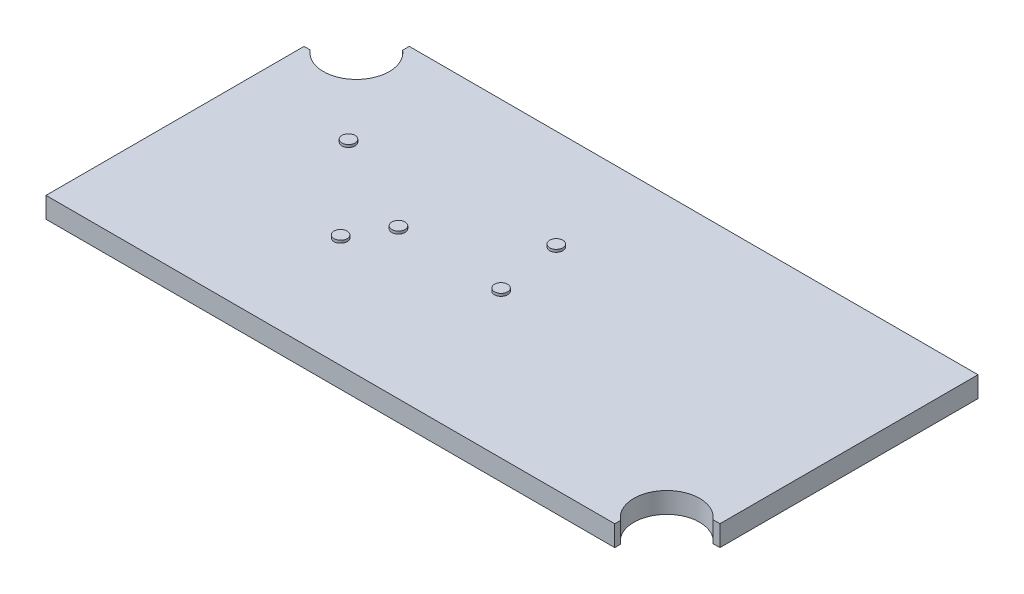
ISO-10303-21;
HEADER;
FILE_DESCRIPTION(('STEP AP214'),'2;1');
FILE_NAME('part.step','',(''),(''),'','','');
FILE_SCHEMA(('AUTOMOTIVE_DESIGN { 1 0 10303 214 1 1 1 1 }'));
ENDSEC;
DATA;
#1=APPLICATION_CONTEXT('core data for automotive mechanical design processes');
#2=APPLICATION_PROTOCOL_DEFINITION('international standard','automotive_design',2000,#1);
#3=PRODUCT_CONTEXT('',#1,'mechanical');
#4=PRODUCT('Part','Part','',(#3));
#5=PRODUCT_RELATED_PRODUCT_CATEGORY('part','',(#4));
#6=PRODUCT_DEFINITION_FORMATION('','',#4);
#7=PRODUCT_DEFINITION_CONTEXT('part definition',#1,'design');
#8=PRODUCT_DEFINITION('design','',#6,#7);
#9=PRODUCT_DEFINITION_SHAPE('','',#8);
#10=(LENGTH_UNIT() NAMED_UNIT(*) SI_UNIT(.MILLI.,.METRE.));
#11=(NAMED_UNIT(*) PLANE_ANGLE_UNIT() SI_UNIT($,.RADIAN.));
#12=(NAMED_UNIT(*) SI_UNIT($,.STERADIAN.) SOLID_ANGLE_UNIT());
#13=UNCERTAINTY_MEASURE_WITH_UNIT(LENGTH_MEASURE(1.E-05),#10,'distance_accuracy_value','');
#14=(GEOMETRIC_REPRESENTATION_CONTEXT(3) GLOBAL_UNCERTAINTY_ASSIGNED_CONTEXT((#13)) GLOBAL_UNIT_ASSIGNED_CONTEXT((#10,
#11,#12)) REPRESENTATION_CONTEXT('',''));
#15=CARTESIAN_POINT('',(0.,0.,0.));
#16=DIRECTION('',(0.,0.,1.));
#17=DIRECTION('',(1.,0.,0.));
#18=AXIS2_PLACEMENT_3D('',#15,#16,#17);
#19=CARTESIAN_POINT('',(13.448,1.,5.976));
#20=DIRECTION('',(0.,1.,0.));
#21=DIRECTION('',(0.,0.,1.));
#22=AXIS2_PLACEMENT_3D('',#19,#20,#21);
#23=PLANE('',#22);
#24=CARTESIAN_POINT('',(-0.522000000000002,1.,-2.66));
#25=DIRECTION('',(0.,1.,0.));
#26=DIRECTION('',(0.,0.,1.));
#27=AXIS2_PLACEMENT_3D('',#24,#25,#26);
#28=CIRCLE('',#27,0.3175);
#29=CARTESIAN_POINT('',(-0.522000000000002,1.,-2.3425));
#30=VERTEX_POINT('',#29);
#31=EDGE_CURVE('E228',#30,#30,#28,.T.);
#32=ORIENTED_EDGE('',*,*,#31,.F.);
#33=EDGE_LOOP('',(#32));
#34=FACE_BOUND('',#33,.T.);
#35=CARTESIAN_POINT('',(-5.094,1.,0.387999999999999));
#36=DIRECTION('',(0.,1.,0.));
#37=DIRECTION('',(0.,0.,1.));
#38=AXIS2_PLACEMENT_3D('',#35,#36,#37);
#39=CIRCLE('',#38,0.3175);
#40=CARTESIAN_POINT('',(-5.094,1.,0.7055));
#41=VERTEX_POINT('',#40);
#42=EDGE_CURVE('E216',#41,#41,#39,.T.);
#43=ORIENTED_EDGE('',*,*,#42,.F.);
#44=EDGE_LOOP('',(#43));
#45=FACE_BOUND('',#44,.T.);
#46=DIRECTION('',(0.,0.,1.));
#47=VECTOR('',#46,1.);
#48=CARTESIAN_POINT('',(-15.,1.,-4.96));
#49=LINE('',#48,#47);
#50=CARTESIAN_POINT('',(-15.,1.,-4.96));
#51=VERTEX_POINT('',#50);
#52=CARTESIAN_POINT('',(-15.,1.,7.5));
#53=VERTEX_POINT('',#52);
#54=EDGE_CURVE('E163',#51,#53,#49,.T.);
#55=ORIENTED_EDGE('',*,*,#54,.T.);
#56=DIRECTION('',(1.,0.,0.));
#57=VECTOR('',#56,1.);
#58=CARTESIAN_POINT('',(-15.,1.,7.5));
#59=LINE('',#58,#57);
#60=CARTESIAN_POINT('',(12.46,1.,7.5));
#61=VERTEX_POINT('',#60);
#62=EDGE_CURVE('E101',#53,#61,#59,.T.);
#63=ORIENTED_EDGE('',*,*,#62,.T.);
#64=DIRECTION('',(0.,0.,-1.));
#65=VECTOR('',#64,1.);
#66=CARTESIAN_POINT('',(12.46,1.,7.5));
#67=LINE('',#66,#65);
#68=CARTESIAN_POINT('',(12.46,1.,7.21858289461911));
#69=VERTEX_POINT('',#68);
#70=EDGE_CURVE('E184',#61,#69,#67,.T.);
#71=ORIENTED_EDGE('',*,*,#70,.T.);
#72=CARTESIAN_POINT('',(13.448,1.,5.976));
#73=DIRECTION('',(0.,-1.,0.));
#74=DIRECTION('',(0.,0.,1.));
#75=AXIS2_PLACEMENT_3D('',#72,#73,#74);
#76=CIRCLE('',#75,1.5875);
#77=CARTESIAN_POINT('',(14.667795167231,1.,4.96));
#78=VERTEX_POINT('',#77);
#79=EDGE_CURVE('E202',#69,#78,#76,.T.);
#80=ORIENTED_EDGE('',*,*,#79,.T.);
#81=DIRECTION('',(1.,0.,0.));
#82=VECTOR('',#81,1.);
#83=CARTESIAN_POINT('',(14.667795167231,1.,4.96));
#84=LINE('',#83,#82);
#85=CARTESIAN_POINT('',(15.,1.,4.96));
#86=VERTEX_POINT('',#85);
#87=EDGE_CURVE('E199',#78,#86,#84,.T.);
#88=ORIENTED_EDGE('',*,*,#87,.T.);
#89=DIRECTION('',(0.,0.,-1.));
#90=VECTOR('',#89,1.);
#91=CARTESIAN_POINT('',(15.,1.,-7.5));
#92=LINE('',#91,#90);
#93=CARTESIAN_POINT('',(15.,1.,-7.5));
#94=VERTEX_POINT('',#93);
#95=EDGE_CURVE('E201',#86,#94,#92,.T.);
#96=ORIENTED_EDGE('',*,*,#95,.T.);
#97=DIRECTION('',(-1.,0.,0.));
#98=VECTOR('',#97,1.);
#99=CARTESIAN_POINT('',(-12.46,1.,-7.5));
#100=LINE('',#99,#98);
#101=CARTESIAN_POINT('',(-12.46,1.,-7.5));
#102=VERTEX_POINT('',#101);
#103=EDGE_CURVE('E126',#94,#102,#100,.T.);
#104=ORIENTED_EDGE('',*,*,#103,.T.);
#105=DIRECTION('',(0.,0.,1.));
#106=VECTOR('',#105,1.);
#107=CARTESIAN_POINT('',(-12.46,1.,-7.5));
#108=LINE('',#107,#106);
#109=CARTESIAN_POINT('',(-12.46,1.,-7.18179516723096));
#110=VERTEX_POINT('',#109);
#111=EDGE_CURVE('E120',#102,#110,#108,.T.);
#112=ORIENTED_EDGE('',*,*,#111,.T.);
#113=CARTESIAN_POINT('',(-13.476,1.,-5.962));
#114=DIRECTION('',(0.,-1.,0.));
#115=DIRECTION('',(0.,0.,1.));
#116=AXIS2_PLACEMENT_3D('',#113,#114,#115);
#117=CIRCLE('',#116,1.5875);
#118=CARTESIAN_POINT('',(-14.7073213431107,1.,-4.96));
#119=VERTEX_POINT('',#118);
#120=EDGE_CURVE('E124',#110,#119,#117,.T.);
#121=ORIENTED_EDGE('',*,*,#120,.T.);
#122=DIRECTION('',(-1.,0.,0.));
#123=VECTOR('',#122,1.);
#124=CARTESIAN_POINT('',(-15.,1.,-4.96));
#125=LINE('',#124,#123);
#126=EDGE_CURVE('E52',#119,#51,#125,.T.);
#127=ORIENTED_EDGE('',*,*,#126,.T.);
#128=EDGE_LOOP('',(#55,#63,#71,#80,#88,#96,#104,#112,#121,#127));
#129=FACE_BOUND('',#128,.T.);
#130=CARTESIAN_POINT('',(-9.92,1.,-2.025));
#131=DIRECTION('',(0.,1.,0.));
#132=DIRECTION('',(0.,0.,1.));
#133=AXIS2_PLACEMENT_3D('',#130,#131,#132);
#134=CIRCLE('',#133,0.3175);
#135=CARTESIAN_POINT('',(-9.92,1.,-1.7075));
#136=VERTEX_POINT('',#135);
#137=EDGE_CURVE('E210',#136,#136,#134,.T.);
#138=ORIENTED_EDGE('',*,*,#137,.F.);
#139=EDGE_LOOP('',(#138));
#140=FACE_BOUND('',#139,.T.);
#141=CARTESIAN_POINT('',(-6.11,1.,2.166));
#142=DIRECTION('',(0.,1.,0.));
#143=DIRECTION('',(0.,0.,1.));
#144=AXIS2_PLACEMENT_3D('',#141,#142,#143);
#145=CIRCLE('',#144,0.3175);
#146=CARTESIAN_POINT('',(-6.11,1.,2.4835));
#147=VERTEX_POINT('',#146);
#148=EDGE_CURVE('E222',#147,#147,#145,.T.);
#149=ORIENTED_EDGE('',*,*,#148,.F.);
#150=EDGE_LOOP('',(#149));
#151=FACE_BOUND('',#150,.T.);
#152=CARTESIAN_POINT('',(-0.0140000000000001,1.,0.514999999999999));
#153=DIRECTION('',(0.,1.,0.));
#154=DIRECTION('',(0.,0.,1.));
#155=AXIS2_PLACEMENT_3D('',#152,#153,#154);
#156=CIRCLE('',#155,0.3175);
#157=CARTESIAN_POINT('',(-0.0140000000000001,1.,0.832499999999999));
#158=VERTEX_POINT('',#157);
#159=EDGE_CURVE('E234',#158,#158,#156,.T.);
#160=ORIENTED_EDGE('',*,*,#159,.F.);
#161=EDGE_LOOP('',(#160));
#162=FACE_BOUND('',#161,.T.);
#163=ADVANCED_FACE('F35',(#34,#45,#129,#140,#151,#162),#23,.T.);
#164=CARTESIAN_POINT('',(-15.,1.,-4.96));
#165=DIRECTION('',(1.,0.,0.));
#166=DIRECTION('',(0.,0.,-1.));
#167=AXIS2_PLACEMENT_3D('',#164,#165,#166);
#168=PLANE('',#167);
#169=DIRECTION('',(0.,0.,1.));
#170=VECTOR('',#169,1.);
#171=CARTESIAN_POINT('',(-15.,0.,-4.96));
#172=LINE('',#171,#170);
#173=CARTESIAN_POINT('',(-15.,0.,-4.96));
#174=VERTEX_POINT('',#173);
#175=CARTESIAN_POINT('',(-15.,0.,7.5));
#176=VERTEX_POINT('',#175);
#177=EDGE_CURVE('E144',#174,#176,#172,.T.);
#178=ORIENTED_EDGE('',*,*,#177,.T.);
#179=DIRECTION('',(0.,-1.,0.));
#180=VECTOR('',#179,1.);
#181=CARTESIAN_POINT('',(-15.,1.,7.5));
#182=LINE('',#181,#180);
#183=EDGE_CURVE('E11',#53,#176,#182,.T.);
#184=ORIENTED_EDGE('',*,*,#183,.F.);
#185=ORIENTED_EDGE('',*,*,#54,.F.);
#186=DIRECTION('',(0.,-1.,0.));
#187=VECTOR('',#186,1.);
#188=CARTESIAN_POINT('',(-15.,1.,-4.96));
#189=LINE('',#188,#187);
#190=EDGE_CURVE('E140',#51,#174,#189,.T.);
#191=ORIENTED_EDGE('',*,*,#190,.T.);
#192=EDGE_LOOP('',(#178,#184,#185,#191));
#193=FACE_BOUND('',#192,.T.);
#194=ADVANCED_FACE('F37',(#193),#168,.F.);
#195=CARTESIAN_POINT('',(-15.,1.,7.5));
#196=DIRECTION('',(0.,0.,-1.));
#197=DIRECTION('',(-1.,0.,0.));
#198=AXIS2_PLACEMENT_3D('',#195,#196,#197);
#199=PLANE('',#198);
#200=DIRECTION('',(1.,0.,0.));
#201=VECTOR('',#200,1.);
#202=CARTESIAN_POINT('',(-15.,0.,7.5));
#203=LINE('',#202,#201);
#204=CARTESIAN_POINT('',(12.46,0.,7.5));
#205=VERTEX_POINT('',#204);
#206=EDGE_CURVE('E147',#176,#205,#203,.T.);
#207=ORIENTED_EDGE('',*,*,#206,.T.);
#208=DIRECTION('',(0.,-1.,0.));
#209=VECTOR('',#208,1.);
#210=CARTESIAN_POINT('',(12.46,1.,7.5));
#211=LINE('',#210,#209);
#212=EDGE_CURVE('E44',#61,#205,#211,.T.);
#213=ORIENTED_EDGE('',*,*,#212,.F.);
#214=ORIENTED_EDGE('',*,*,#62,.F.);
#215=ORIENTED_EDGE('',*,*,#183,.T.);
#216=EDGE_LOOP('',(#207,#213,#214,#215));
#217=FACE_BOUND('',#216,.T.);
#218=ADVANCED_FACE('F255',(#217),#199,.F.);
#219=CARTESIAN_POINT('',(12.46,1.,7.5));
#220=DIRECTION('',(-1.,0.,0.));
#221=DIRECTION('',(0.,0.,1.));
#222=AXIS2_PLACEMENT_3D('',#219,#220,#221);
#223=PLANE('',#222);
#224=DIRECTION('',(0.,0.,-1.));
#225=VECTOR('',#224,1.);
#226=CARTESIAN_POINT('',(12.46,0.,7.5));
#227=LINE('',#226,#225);
#228=CARTESIAN_POINT('',(12.46,0.,7.21858289461911));
#229=VERTEX_POINT('',#228);
#230=EDGE_CURVE('E150',#205,#229,#227,.T.);
#231=ORIENTED_EDGE('',*,*,#230,.T.);
#232=DIRECTION('',(0.,-1.,0.));
#233=VECTOR('',#232,1.);
#234=CARTESIAN_POINT('',(12.46,1.,7.21858289461911));
#235=LINE('',#234,#233);
#236=EDGE_CURVE('E176',#69,#229,#235,.T.);
#237=ORIENTED_EDGE('',*,*,#236,.F.);
#238=ORIENTED_EDGE('',*,*,#70,.F.);
#239=ORIENTED_EDGE('',*,*,#212,.T.);
#240=EDGE_LOOP('',(#231,#237,#238,#239));
#241=FACE_BOUND('',#240,.T.);
#242=ADVANCED_FACE('F182',(#241),#223,.F.);
#243=CARTESIAN_POINT('',(13.448,1.,5.976));
#244=DIRECTION('',(0.,-1.,0.));
#245=DIRECTION('',(0.,0.,-1.));
#246=AXIS2_PLACEMENT_3D('',#243,#244,#245);
#247=CYLINDRICAL_SURFACE('',#246,1.5875);
#248=CARTESIAN_POINT('',(13.448,0.,5.976));
#249=DIRECTION('',(0.,-1.,0.));
#250=DIRECTION('',(0.,0.,1.));
#251=AXIS2_PLACEMENT_3D('',#248,#249,#250);
#252=CIRCLE('',#251,1.5875);
#253=CARTESIAN_POINT('',(14.667795167231,0.,4.96));
#254=VERTEX_POINT('',#253);
#255=EDGE_CURVE('E152',#229,#254,#252,.T.);
#256=ORIENTED_EDGE('',*,*,#255,.T.);
#257=DIRECTION('',(0.,-1.,0.));
#258=VECTOR('',#257,1.);
#259=CARTESIAN_POINT('',(14.667795167231,1.,4.96));
#260=LINE('',#259,#258);
#261=EDGE_CURVE('E173',#78,#254,#260,.T.);
#262=ORIENTED_EDGE('',*,*,#261,.F.);
#263=ORIENTED_EDGE('',*,*,#79,.F.);
#264=ORIENTED_EDGE('',*,*,#236,.T.);
#265=EDGE_LOOP('',(#256,#262,#263,#264));
#266=FACE_BOUND('',#265,.T.);
#267=ADVANCED_FACE('F193',(#266),#247,.F.);
#268=CARTESIAN_POINT('',(14.667795167231,1.,4.96));
#269=DIRECTION('',(0.,0.,-1.));
#270=DIRECTION('',(-1.,0.,0.));
#271=AXIS2_PLACEMENT_3D('',#268,#269,#270);
#272=PLANE('',#271);
#273=DIRECTION('',(1.,0.,0.));
#274=VECTOR('',#273,1.);
#275=CARTESIAN_POINT('',(14.667795167231,0.,4.96));
#276=LINE('',#275,#274);
#277=CARTESIAN_POINT('',(15.,0.,4.96));
#278=VERTEX_POINT('',#277);
#279=EDGE_CURVE('E154',#254,#278,#276,.T.);
#280=ORIENTED_EDGE('',*,*,#279,.T.);
#281=DIRECTION('',(0.,-1.,0.));
#282=VECTOR('',#281,1.);
#283=CARTESIAN_POINT('',(15.,1.,4.96));
#284=LINE('',#283,#282);
#285=EDGE_CURVE('E170',#86,#278,#284,.T.);
#286=ORIENTED_EDGE('',*,*,#285,.F.);
#287=ORIENTED_EDGE('',*,*,#87,.F.);
#288=ORIENTED_EDGE('',*,*,#261,.T.);
#289=EDGE_LOOP('',(#280,#286,#287,#288));
#290=FACE_BOUND('',#289,.T.);
#291=ADVANCED_FACE('F197',(#290),#272,.F.);
#292=CARTESIAN_POINT('',(15.,1.,-7.5));
#293=DIRECTION('',(-1.,0.,0.));
#294=DIRECTION('',(0.,0.,1.));
#295=AXIS2_PLACEMENT_3D('',#292,#293,#294);
#296=PLANE('',#295);
#297=DIRECTION('',(0.,0.,-1.));
#298=VECTOR('',#297,1.);
#299=CARTESIAN_POINT('',(15.,0.,-7.5));
#300=LINE('',#299,#298);
#301=CARTESIAN_POINT('',(15.,0.,-7.5));
#302=VERTEX_POINT('',#301);
#303=EDGE_CURVE('E156',#278,#302,#300,.T.);
#304=ORIENTED_EDGE('',*,*,#303,.T.);
#305=DIRECTION('',(0.,-1.,0.));
#306=VECTOR('',#305,1.);
#307=CARTESIAN_POINT('',(15.,1.,-7.5));
#308=LINE('',#307,#306);
#309=EDGE_CURVE('E167',#94,#302,#308,.T.);
#310=ORIENTED_EDGE('',*,*,#309,.F.);
#311=ORIENTED_EDGE('',*,*,#95,.F.);
#312=ORIENTED_EDGE('',*,*,#285,.T.);
#313=EDGE_LOOP('',(#304,#310,#311,#312));
#314=FACE_BOUND('',#313,.T.);
#315=ADVANCED_FACE('F275',(#314),#296,.F.);
#316=CARTESIAN_POINT('',(-12.46,1.,-7.5));
#317=DIRECTION('',(0.,0.,1.));
#318=DIRECTION('',(1.,0.,0.));
#319=AXIS2_PLACEMENT_3D('',#316,#317,#318);
#320=PLANE('',#319);
#321=DIRECTION('',(-1.,0.,0.));
#322=VECTOR('',#321,1.);
#323=CARTESIAN_POINT('',(-12.46,0.,-7.5));
#324=LINE('',#323,#322);
#325=CARTESIAN_POINT('',(-12.46,0.,-7.5));
#326=VERTEX_POINT('',#325);
#327=EDGE_CURVE('E158',#302,#326,#324,.T.);
#328=ORIENTED_EDGE('',*,*,#327,.T.);
#329=DIRECTION('',(0.,-1.,0.));
#330=VECTOR('',#329,1.);
#331=CARTESIAN_POINT('',(-12.46,1.,-7.5));
#332=LINE('',#331,#330);
#333=EDGE_CURVE('E135',#102,#326,#332,.T.);
#334=ORIENTED_EDGE('',*,*,#333,.F.);
#335=ORIENTED_EDGE('',*,*,#103,.F.);
#336=ORIENTED_EDGE('',*,*,#309,.T.);
#337=EDGE_LOOP('',(#328,#334,#335,#336));
#338=FACE_BOUND('',#337,.T.);
#339=ADVANCED_FACE('F272',(#338),#320,.F.);
#340=CARTESIAN_POINT('',(-12.46,1.,-7.5));
#341=DIRECTION('',(1.,0.,0.));
#342=DIRECTION('',(0.,0.,-1.));
#343=AXIS2_PLACEMENT_3D('',#340,#341,#342);
#344=PLANE('',#343);
#345=DIRECTION('',(0.,0.,1.));
#346=VECTOR('',#345,1.);
#347=CARTESIAN_POINT('',(-12.46,0.,-7.5));
#348=LINE('',#347,#346);
#349=CARTESIAN_POINT('',(-12.46,0.,-7.18179516723096));
#350=VERTEX_POINT('',#349);
#351=EDGE_CURVE('E134',#326,#350,#348,.T.);
#352=ORIENTED_EDGE('',*,*,#351,.T.);
#353=DIRECTION('',(0.,-1.,0.));
#354=VECTOR('',#353,1.);
#355=CARTESIAN_POINT('',(-12.46,1.,-7.18179516723096));
#356=LINE('',#355,#354);
#357=EDGE_CURVE('E131',#110,#350,#356,.T.);
#358=ORIENTED_EDGE('',*,*,#357,.F.);
#359=ORIENTED_EDGE('',*,*,#111,.F.);
#360=ORIENTED_EDGE('',*,*,#333,.T.);
#361=EDGE_LOOP('',(#352,#358,#359,#360));
#362=FACE_BOUND('',#361,.T.);
#363=ADVANCED_FACE('F132',(#362),#344,.F.);
#364=CARTESIAN_POINT('',(-13.476,1.,-5.962));
#365=DIRECTION('',(0.,-1.,0.));
#366=DIRECTION('',(0.,0.,-1.));
#367=AXIS2_PLACEMENT_3D('',#364,#365,#366);
#368=CYLINDRICAL_SURFACE('',#367,1.5875);
#369=CARTESIAN_POINT('',(-13.476,0.,-5.962));
#370=DIRECTION('',(0.,-1.,0.));
#371=DIRECTION('',(0.,0.,1.));
#372=AXIS2_PLACEMENT_3D('',#369,#370,#371);
#373=CIRCLE('',#372,1.5875);
#374=CARTESIAN_POINT('',(-14.7073213431107,0.,-4.96));
#375=VERTEX_POINT('',#374);
#376=EDGE_CURVE('E87',#350,#375,#373,.T.);
#377=ORIENTED_EDGE('',*,*,#376,.T.);
#378=DIRECTION('',(0.,-1.,0.));
#379=VECTOR('',#378,1.);
#380=CARTESIAN_POINT('',(-14.7073213431107,1.,-4.96));
#381=LINE('',#380,#379);
#382=EDGE_CURVE('E136',#119,#375,#381,.T.);
#383=ORIENTED_EDGE('',*,*,#382,.F.);
#384=ORIENTED_EDGE('',*,*,#120,.F.);
#385=ORIENTED_EDGE('',*,*,#357,.T.);
#386=EDGE_LOOP('',(#377,#383,#384,#385));
#387=FACE_BOUND('',#386,.T.);
#388=ADVANCED_FACE('F138',(#387),#368,.F.);
#389=CARTESIAN_POINT('',(-15.,1.,-4.96));
#390=DIRECTION('',(0.,0.,1.));
#391=DIRECTION('',(1.,0.,0.));
#392=AXIS2_PLACEMENT_3D('',#389,#390,#391);
#393=PLANE('',#392);
#394=DIRECTION('',(-1.,0.,0.));
#395=VECTOR('',#394,1.);
#396=CARTESIAN_POINT('',(-15.,0.,-4.96));
#397=LINE('',#396,#395);
#398=EDGE_CURVE('E93',#375,#174,#397,.T.);
#399=ORIENTED_EDGE('',*,*,#398,.T.);
#400=ORIENTED_EDGE('',*,*,#190,.F.);
#401=ORIENTED_EDGE('',*,*,#126,.F.);
#402=ORIENTED_EDGE('',*,*,#382,.T.);
#403=EDGE_LOOP('',(#399,#400,#401,#402));
#404=FACE_BOUND('',#403,.T.);
#405=ADVANCED_FACE('F265',(#404),#393,.F.);
#406=CARTESIAN_POINT('',(13.448,0.,5.976));
#407=DIRECTION('',(0.,1.,0.));
#408=DIRECTION('',(0.,0.,1.));
#409=AXIS2_PLACEMENT_3D('',#406,#407,#408);
#410=PLANE('',#409);
#411=ORIENTED_EDGE('',*,*,#177,.F.);
#412=ORIENTED_EDGE('',*,*,#398,.F.);
#413=ORIENTED_EDGE('',*,*,#376,.F.);
#414=ORIENTED_EDGE('',*,*,#351,.F.);
#415=ORIENTED_EDGE('',*,*,#327,.F.);
#416=ORIENTED_EDGE('',*,*,#303,.F.);
#417=ORIENTED_EDGE('',*,*,#279,.F.);
#418=ORIENTED_EDGE('',*,*,#255,.F.);
#419=ORIENTED_EDGE('',*,*,#230,.F.);
#420=ORIENTED_EDGE('',*,*,#206,.F.);
#421=EDGE_LOOP('',(#411,#412,#413,#414,#415,#416,#417,#418,#419,#420));
#422=FACE_BOUND('',#421,.T.);
#423=ADVANCED_FACE('F188',(#422),#410,.F.);
#424=CARTESIAN_POINT('',(-9.92,1.127,-2.025));
#425=DIRECTION('',(0.,-1.,0.));
#426=DIRECTION('',(0.,0.,-1.));
#427=AXIS2_PLACEMENT_3D('',#424,#425,#426);
#428=CYLINDRICAL_SURFACE('',#427,0.3175);
#429=CARTESIAN_POINT('',(-9.92,1.127,-2.025));
#430=DIRECTION('',(0.,1.,0.));
#431=DIRECTION('',(0.,0.,1.));
#432=AXIS2_PLACEMENT_3D('',#429,#430,#431);
#433=CIRCLE('',#432,0.3175);
#434=CARTESIAN_POINT('',(-9.92,1.127,-1.7075));
#435=VERTEX_POINT('',#434);
#436=EDGE_CURVE('E148',#435,#435,#433,.T.);
#437=ORIENTED_EDGE('',*,*,#436,.F.);
#438=EDGE_LOOP('',(#437));
#439=FACE_BOUND('',#438,.T.);
#440=ORIENTED_EDGE('',*,*,#137,.T.);
#441=EDGE_LOOP('',(#440));
#442=FACE_BOUND('',#441,.T.);
#443=ADVANCED_FACE('F261',(#439,#442),#428,.T.);
#444=CARTESIAN_POINT('',(-9.92,1.127,-2.025));
#445=DIRECTION('',(0.,1.,0.));
#446=DIRECTION('',(0.,0.,1.));
#447=AXIS2_PLACEMENT_3D('',#444,#445,#446);
#448=PLANE('',#447);
#449=ORIENTED_EDGE('',*,*,#436,.T.);
#450=EDGE_LOOP('',(#449));
#451=FACE_BOUND('',#450,.T.);
#452=ADVANCED_FACE('F336',(#451),#448,.T.);
#453=CARTESIAN_POINT('',(-5.094,1.127,0.387999999999999));
#454=DIRECTION('',(0.,-1.,0.));
#455=DIRECTION('',(0.,0.,-1.));
#456=AXIS2_PLACEMENT_3D('',#453,#454,#455);
#457=CYLINDRICAL_SURFACE('',#456,0.3175);
#458=CARTESIAN_POINT('',(-5.094,1.127,0.387999999999999));
#459=DIRECTION('',(0.,1.,0.));
#460=DIRECTION('',(0.,0.,1.));
#461=AXIS2_PLACEMENT_3D('',#458,#459,#460);
#462=CIRCLE('',#461,0.3175);
#463=CARTESIAN_POINT('',(-5.094,1.127,0.7055));
#464=VERTEX_POINT('',#463);
#465=EDGE_CURVE('E213',#464,#464,#462,.T.);
#466=ORIENTED_EDGE('',*,*,#465,.F.);
#467=EDGE_LOOP('',(#466));
#468=FACE_BOUND('',#467,.T.);
#469=ORIENTED_EDGE('',*,*,#42,.T.);
#470=EDGE_LOOP('',(#469));
#471=FACE_BOUND('',#470,.T.);
#472=ADVANCED_FACE('F343',(#468,#471),#457,.T.);
#473=CARTESIAN_POINT('',(-5.094,1.127,0.387999999999999));
#474=DIRECTION('',(0.,1.,0.));
#475=DIRECTION('',(0.,0.,1.));
#476=AXIS2_PLACEMENT_3D('',#473,#474,#475);
#477=PLANE('',#476);
#478=ORIENTED_EDGE('',*,*,#465,.T.);
#479=EDGE_LOOP('',(#478));
#480=FACE_BOUND('',#479,.T.);
#481=ADVANCED_FACE('F350',(#480),#477,.T.);
#482=CARTESIAN_POINT('',(-6.11,1.127,2.166));
#483=DIRECTION('',(0.,-1.,0.));
#484=DIRECTION('',(0.,0.,-1.));
#485=AXIS2_PLACEMENT_3D('',#482,#483,#484);
#486=CYLINDRICAL_SURFACE('',#485,0.3175);
#487=CARTESIAN_POINT('',(-6.11,1.127,2.166));
#488=DIRECTION('',(0.,1.,0.));
#489=DIRECTION('',(0.,0.,1.));
#490=AXIS2_PLACEMENT_3D('',#487,#488,#489);
#491=CIRCLE('',#490,0.3175);
#492=CARTESIAN_POINT('',(-6.11,1.127,2.4835));
#493=VERTEX_POINT('',#492);
#494=EDGE_CURVE('E219',#493,#493,#491,.T.);
#495=ORIENTED_EDGE('',*,*,#494,.F.);
#496=EDGE_LOOP('',(#495));
#497=FACE_BOUND('',#496,.T.);
#498=ORIENTED_EDGE('',*,*,#148,.T.);
#499=EDGE_LOOP('',(#498));
#500=FACE_BOUND('',#499,.T.);
#501=ADVANCED_FACE('F358',(#497,#500),#486,.T.);
#502=CARTESIAN_POINT('',(-6.11,1.127,2.166));
#503=DIRECTION('',(0.,1.,0.));
#504=DIRECTION('',(0.,0.,1.));
#505=AXIS2_PLACEMENT_3D('',#502,#503,#504);
#506=PLANE('',#505);
#507=ORIENTED_EDGE('',*,*,#494,.T.);
#508=EDGE_LOOP('',(#507));
#509=FACE_BOUND('',#508,.T.);
#510=ADVANCED_FACE('F366',(#509),#506,.T.);
#511=CARTESIAN_POINT('',(-0.522000000000002,1.127,-2.66));
#512=DIRECTION('',(0.,-1.,0.));
#513=DIRECTION('',(0.,0.,-1.));
#514=AXIS2_PLACEMENT_3D('',#511,#512,#513);
#515=CYLINDRICAL_SURFACE('',#514,0.3175);
#516=CARTESIAN_POINT('',(-0.522000000000002,1.127,-2.66));
#517=DIRECTION('',(0.,1.,0.));
#518=DIRECTION('',(0.,0.,1.));
#519=AXIS2_PLACEMENT_3D('',#516,#517,#518);
#520=CIRCLE('',#519,0.3175);
#521=CARTESIAN_POINT('',(-0.522000000000002,1.127,-2.3425));
#522=VERTEX_POINT('',#521);
#523=EDGE_CURVE('E225',#522,#522,#520,.T.);
#524=ORIENTED_EDGE('',*,*,#523,.F.);
#525=EDGE_LOOP('',(#524));
#526=FACE_BOUND('',#525,.T.);
#527=ORIENTED_EDGE('',*,*,#31,.T.);
#528=EDGE_LOOP('',(#527));
#529=FACE_BOUND('',#528,.T.);
#530=ADVANCED_FACE('F374',(#526,#529),#515,.T.);
#531=CARTESIAN_POINT('',(-0.522000000000002,1.127,-2.66));
#532=DIRECTION('',(0.,1.,0.));
#533=DIRECTION('',(0.,0.,1.));
#534=AXIS2_PLACEMENT_3D('',#531,#532,#533);
#535=PLANE('',#534);
#536=ORIENTED_EDGE('',*,*,#523,.T.);
#537=EDGE_LOOP('',(#536));
#538=FACE_BOUND('',#537,.T.);
#539=ADVANCED_FACE('F245',(#538),#535,.T.);
#540=CARTESIAN_POINT('',(-0.0140000000000001,1.127,0.514999999999999));
#541=DIRECTION('',(0.,-1.,0.));
#542=DIRECTION('',(0.,0.,-1.));
#543=AXIS2_PLACEMENT_3D('',#540,#541,#542);
#544=CYLINDRICAL_SURFACE('',#543,0.3175);
#545=CARTESIAN_POINT('',(-0.0140000000000001,1.127,0.514999999999999));
#546=DIRECTION('',(0.,1.,0.));
#547=DIRECTION('',(0.,0.,1.));
#548=AXIS2_PLACEMENT_3D('',#545,#546,#547);
#549=CIRCLE('',#548,0.3175);
#550=CARTESIAN_POINT('',(-0.0140000000000001,1.127,0.832499999999999));
#551=VERTEX_POINT('',#550);
#552=EDGE_CURVE('E231',#551,#551,#549,.T.);
#553=ORIENTED_EDGE('',*,*,#552,.F.);
#554=EDGE_LOOP('',(#553));
#555=FACE_BOUND('',#554,.T.);
#556=ORIENTED_EDGE('',*,*,#159,.T.);
#557=EDGE_LOOP('',(#556));
#558=FACE_BOUND('',#557,.T.);
#559=ADVANCED_FACE('F242',(#555,#558),#544,.T.);
#560=CARTESIAN_POINT('',(-0.0140000000000001,1.127,0.514999999999999));
#561=DIRECTION('',(0.,1.,0.));
#562=DIRECTION('',(0.,0.,1.));
#563=AXIS2_PLACEMENT_3D('',#560,#561,#562);
#564=PLANE('',#563);
#565=ORIENTED_EDGE('',*,*,#552,.T.);
#566=EDGE_LOOP('',(#565));
#567=FACE_BOUND('',#566,.T.);
#568=ADVANCED_FACE('F240',(#567),#564,.T.);
#569=CLOSED_SHELL('',(#163,#194,#218,#242,#267,#291,#315,#339,#363,#388,#405,#423,#443,#452,
#472,#481,#501,#510,#530,#539,#559,#568));
#570=MANIFOLD_SOLID_BREP('B2',#569);
#571=ADVANCED_BREP_SHAPE_REPRESENTATION('',(#18,#570),#14);
#572=SHAPE_DEFINITION_REPRESENTATION(#9,#571);
ENDSEC;
END-ISO-10303-21;
